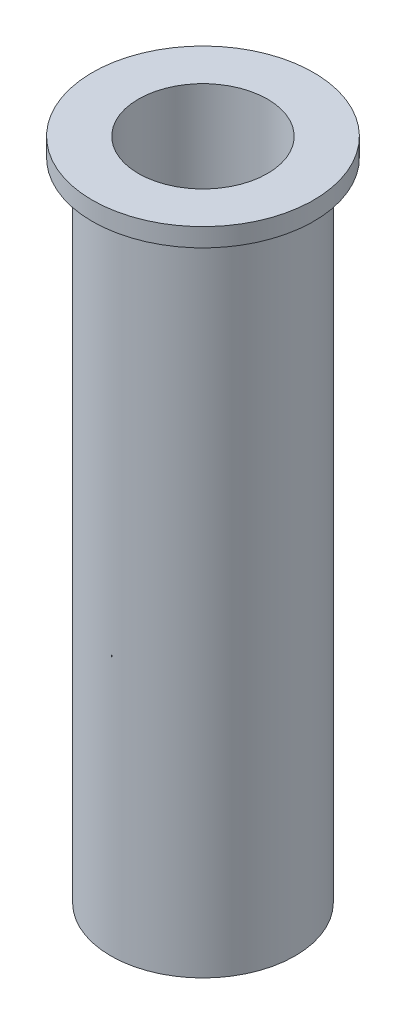
ISO-10303-21;
HEADER;
FILE_DESCRIPTION(('STEP AP214'),'2;1');
FILE_NAME('part.step','',(''),(''),'','','');
FILE_SCHEMA(('AUTOMOTIVE_DESIGN { 1 0 10303 214 1 1 1 1 }'));
ENDSEC;
DATA;
#1=APPLICATION_CONTEXT('core data for automotive mechanical design processes');
#2=APPLICATION_PROTOCOL_DEFINITION('international standard','automotive_design',2000,#1);
#3=PRODUCT_CONTEXT('',#1,'mechanical');
#4=PRODUCT('Part','Part','',(#3));
#5=PRODUCT_RELATED_PRODUCT_CATEGORY('part','',(#4));
#6=PRODUCT_DEFINITION_FORMATION('','',#4);
#7=PRODUCT_DEFINITION_CONTEXT('part definition',#1,'design');
#8=PRODUCT_DEFINITION('design','',#6,#7);
#9=PRODUCT_DEFINITION_SHAPE('','',#8);
#10=(LENGTH_UNIT() NAMED_UNIT(*) SI_UNIT(.MILLI.,.METRE.));
#11=(NAMED_UNIT(*) PLANE_ANGLE_UNIT() SI_UNIT($,.RADIAN.));
#12=(NAMED_UNIT(*) SI_UNIT($,.STERADIAN.) SOLID_ANGLE_UNIT());
#13=UNCERTAINTY_MEASURE_WITH_UNIT(LENGTH_MEASURE(1.E-05),#10,'distance_accuracy_value','');
#14=(GEOMETRIC_REPRESENTATION_CONTEXT(3) GLOBAL_UNCERTAINTY_ASSIGNED_CONTEXT((#13)) GLOBAL_UNIT_ASSIGNED_CONTEXT((#10,
#11,#12)) REPRESENTATION_CONTEXT('',''));
#15=CARTESIAN_POINT('',(0.,0.,0.));
#16=DIRECTION('',(0.,0.,1.));
#17=DIRECTION('',(1.,0.,0.));
#18=AXIS2_PLACEMENT_3D('',#15,#16,#17);
#19=CARTESIAN_POINT('',(0.,70.,0.));
#20=DIRECTION('',(0.,-1.,0.));
#21=DIRECTION('',(0.,0.,-1.));
#22=AXIS2_PLACEMENT_3D('',#19,#20,#21);
#23=CYLINDRICAL_SURFACE('',#22,10.);
#24=CARTESIAN_POINT('',(-9.79795897113271,58.,-2.));
#25=CARTESIAN_POINT('',(-9.79795611157838,58.0556671372987,-2.00000029709047));
#26=CARTESIAN_POINT('',(-9.79843398465431,58.1113070388049,-1.99767440405642));
#27=CARTESIAN_POINT('',(-9.80032138150132,58.2221774356675,-1.98839986829158));
#28=CARTESIAN_POINT('',(-9.80173079002197,58.2774079808152,-1.98145179742019));
#29=CARTESIAN_POINT('',(-9.8073028328515,58.4417098803016,-1.95376239954904));
#30=CARTESIAN_POINT('',(-9.81280956758554,58.5496628575345,-1.92617555297558));
#31=CARTESIAN_POINT('',(-9.8267766040168,58.7592851934839,-1.85359362042639));
#32=CARTESIAN_POINT('',(-9.83523723174864,58.8609538571135,-1.80859661275257));
#33=CARTESIAN_POINT('',(-9.85415440257657,59.0553297677597,-1.7025082088197));
#34=CARTESIAN_POINT('',(-9.86461115250626,59.1480360846177,-1.64141514447462));
#35=CARTESIAN_POINT('',(-9.88650550448304,59.3231196733701,-1.50396101869285));
#36=CARTESIAN_POINT('',(-9.89795377776164,59.4053525644588,-1.42741780364326));
#37=CARTESIAN_POINT('',(-9.92044851228358,59.5559088785751,-1.26162118198369));
#38=CARTESIAN_POINT('',(-9.93149491105252,59.624230146461,-1.17236580968336));
#39=CARTESIAN_POINT('',(-9.95205620855081,59.7455778018475,-0.982720106800591));
#40=CARTESIAN_POINT('',(-9.96155694564014,59.7984659384246,-0.882239649549986));
#41=CARTESIAN_POINT('',(-9.97783510908995,59.8865517690996,-0.673602404217798));
#42=CARTESIAN_POINT('',(-9.9846129382442,59.9217520799118,-0.565446754297828));
#43=CARTESIAN_POINT('',(-9.99460635553984,59.9730140969379,-0.346034817774204));
#44=CARTESIAN_POINT('',(-9.99786765043076,59.9893215789678,-0.234838069151996));
#45=CARTESIAN_POINT('',(-10.0006184349224,60.0031019588768,-0.0112397534982637));
#46=CARTESIAN_POINT('',(-10.000108200481,60.0005762347569,0.101161724783846));
#47=CARTESIAN_POINT('',(-9.99540868887644,59.9769475992568,0.322284405513383));
#48=CARTESIAN_POINT('',(-9.9912719366342,59.9561099001905,0.431035226714458));
#49=CARTESIAN_POINT('',(-9.97984349003516,59.8968696460479,0.643464013108166));
#50=CARTESIAN_POINT('',(-9.97255169250401,59.8584665165555,0.747141812282545));
#51=CARTESIAN_POINT('',(-9.95554578241051,59.7649391930093,0.947240542625917));
#52=CARTESIAN_POINT('',(-9.94581664782192,59.7097108261481,1.04361145363294));
#53=CARTESIAN_POINT('',(-9.92500903258345,59.5841794594466,1.22581287576612));
#54=CARTESIAN_POINT('',(-9.91393044014086,59.5138752103125,1.31164251244036));
#55=CARTESIAN_POINT('',(-9.8914207473701,59.3587432767496,1.47189241307715));
#56=CARTESIAN_POINT('',(-9.8799868648348,59.2736851958569,1.54608938999208));
#57=CARTESIAN_POINT('',(-9.85823412232848,59.0921904830222,1.67922179979889));
#58=CARTESIAN_POINT('',(-9.84791557170815,58.9957507096675,1.73815300484306));
#59=CARTESIAN_POINT('',(-9.82955460084642,58.7938951901082,1.83915990928954));
#60=CARTESIAN_POINT('',(-9.8215183899669,58.6884559532069,1.881189753269));
#61=CARTESIAN_POINT('',(-9.80872322124987,58.4718827374886,1.94681419465982));
#62=CARTESIAN_POINT('',(-9.80395938256574,58.3607575067037,1.97043625496866));
#63=CARTESIAN_POINT('',(-9.80006354383926,58.2072863663071,1.98966587624393));
#64=CARTESIAN_POINT('',(-9.79927519743986,58.1658917204351,1.99354251131102));
#65=CARTESIAN_POINT('',(-9.79822334773544,58.0830042717252,1.9987063293293));
#66=CARTESIAN_POINT('',(-9.79795896609649,58.0415117500884,1.99999784580931));
#67=CARTESIAN_POINT('',(-9.79795897113271,58.,2.));
#68=B_SPLINE_CURVE_WITH_KNOTS('',3,(#24,#25,#26,#27,#28,#29,#30,#31,#32,#33,#34,#35,#36,#37,#38,
#39,#40,#41,#42,#43,#44,#45,#46,#47,#48,#49,#50,#51,#52,#53,#54,#55,#56,#57,#58,#59,#60,#61,#62,
#63,#64,#65,#66,#67),.UNSPECIFIED.,.F.,.F.,(4,2,2,2,2,2,2,2,2,2,2,2,2,2,2,2,2,2,2,2,2,4),(0.,
0.166897020715845,0.33377339664307,0.666722601037227,0.999708566174145,1.33272905329864,
1.66993288931439,2.00718892413592,2.34737937755194,2.68751948879679,3.02318320738907,
3.35882236614863,3.68967912555437,4.0205467052512,4.35350597112352,4.68649283901807,
5.02524540329292,5.3640916848566,5.70385119298727,6.04310283225105,6.16778801087552,
6.29226399953898),.UNSPECIFIED.);
#69=CARTESIAN_POINT('',(-9.79795897113271,58.,-2.));
#70=VERTEX_POINT('',#69);
#71=CARTESIAN_POINT('',(-9.79795897113271,58.,2.));
#72=VERTEX_POINT('',#71);
#73=EDGE_CURVE('E118',#70,#72,#68,.T.);
#74=ORIENTED_EDGE('',*,*,#73,.T.);
#75=DIRECTION('',(0.,-1.,0.));
#76=VECTOR('',#75,1.);
#77=CARTESIAN_POINT('',(-9.79795897113271,70.,2.));
#78=LINE('',#77,#76);
#79=CARTESIAN_POINT('',(-9.79795897113271,48.,2.));
#80=VERTEX_POINT('',#79);
#81=EDGE_CURVE('E126',#72,#80,#78,.T.);
#82=ORIENTED_EDGE('',*,*,#81,.T.);
#83=CARTESIAN_POINT('',(-9.79795897113271,48.,2.));
#84=CARTESIAN_POINT('',(-9.79795611157838,47.9443328627013,2.00000029709046));
#85=CARTESIAN_POINT('',(-9.79843398465431,47.8886929611951,1.99767440405641));
#86=CARTESIAN_POINT('',(-9.80032138150132,47.7778225643325,1.98839986829158));
#87=CARTESIAN_POINT('',(-9.80173079002197,47.7225920191848,1.98145179742018));
#88=CARTESIAN_POINT('',(-9.8073028328515,47.5582901196984,1.95376239954903));
#89=CARTESIAN_POINT('',(-9.81280956758554,47.4503371424655,1.92617555297558));
#90=CARTESIAN_POINT('',(-9.8267766040168,47.2407148065161,1.85359362042638));
#91=CARTESIAN_POINT('',(-9.83523723174864,47.1390461428865,1.80859661275256));
#92=CARTESIAN_POINT('',(-9.85415440257657,46.9446702322403,1.70250820881969));
#93=CARTESIAN_POINT('',(-9.86461115250626,46.8519639153823,1.64141514447461));
#94=CARTESIAN_POINT('',(-9.88650550448304,46.6768803266299,1.50396101869285));
#95=CARTESIAN_POINT('',(-9.89795377776164,46.5946474355412,1.42741780364326));
#96=CARTESIAN_POINT('',(-9.92044851228358,46.4440911214249,1.26162118198369));
#97=CARTESIAN_POINT('',(-9.93149491105252,46.375769853539,1.17236580968335));
#98=CARTESIAN_POINT('',(-9.95205620855081,46.2544221981525,0.982720106800585));
#99=CARTESIAN_POINT('',(-9.96155694564014,46.2015340615754,0.882239649549979));
#100=CARTESIAN_POINT('',(-9.97783510908995,46.1134482309004,0.673602404217791));
#101=CARTESIAN_POINT('',(-9.9846129382442,46.0782479200882,0.565446754297822));
#102=CARTESIAN_POINT('',(-9.99460635553984,46.0269859030621,0.346034817774198));
#103=CARTESIAN_POINT('',(-9.99786765043076,46.0106784210322,0.234838069151989));
#104=CARTESIAN_POINT('',(-10.0006184349224,45.9968980411232,0.0112397534982574));
#105=CARTESIAN_POINT('',(-10.000108200481,45.9994237652431,-0.101161724783852));
#106=CARTESIAN_POINT('',(-9.99540868887644,46.0230524007432,-0.32228440551339));
#107=CARTESIAN_POINT('',(-9.9912719366342,46.0438900998095,-0.431035226714465));
#108=CARTESIAN_POINT('',(-9.97984349003516,46.1031303539521,-0.643464013108173));
#109=CARTESIAN_POINT('',(-9.97255169250401,46.1415334834445,-0.747141812282552));
#110=CARTESIAN_POINT('',(-9.95554578241051,46.2350608069907,-0.947240542625924));
#111=CARTESIAN_POINT('',(-9.94581664782192,46.2902891738519,-1.04361145363295));
#112=CARTESIAN_POINT('',(-9.92500903258345,46.4158205405534,-1.22581287576613));
#113=CARTESIAN_POINT('',(-9.91393044014086,46.4861247896875,-1.31164251244037));
#114=CARTESIAN_POINT('',(-9.8914207473701,46.6412567232505,-1.47189241307716));
#115=CARTESIAN_POINT('',(-9.8799868648348,46.7263148041431,-1.54608938999209));
#116=CARTESIAN_POINT('',(-9.85823412232848,46.9078095169778,-1.6792217997989));
#117=CARTESIAN_POINT('',(-9.84791557170815,47.0042492903325,-1.73815300484307));
#118=CARTESIAN_POINT('',(-9.82955460084642,47.2061048098918,-1.83915990928954));
#119=CARTESIAN_POINT('',(-9.8215183899669,47.3115440467932,-1.88118975326901));
#120=CARTESIAN_POINT('',(-9.80872322124987,47.5281172625114,-1.94681419465983));
#121=CARTESIAN_POINT('',(-9.80395938256574,47.6392424932963,-1.97043625496866));
#122=CARTESIAN_POINT('',(-9.80006354383926,47.7927136336929,-1.98966587624394));
#123=CARTESIAN_POINT('',(-9.79927519743986,47.8341082795649,-1.99354251131103));
#124=CARTESIAN_POINT('',(-9.79822334773544,47.9169957282749,-1.99870632932931));
#125=CARTESIAN_POINT('',(-9.79795896609649,47.9584882499116,-1.99999784580932));
#126=CARTESIAN_POINT('',(-9.79795897113271,48.,-2.00000000000001));
#127=B_SPLINE_CURVE_WITH_KNOTS('',3,(#83,#84,#85,#86,#87,#88,#89,#90,#91,#92,#93,#94,#95,#96,
#97,#98,#99,#100,#101,#102,#103,#104,#105,#106,#107,#108,#109,#110,#111,#112,#113,#114,#115,
#116,#117,#118,#119,#120,#121,#122,#123,#124,#125,#126),.UNSPECIFIED.,.F.,.F.,(4,2,2,2,2,2,2,2,
2,2,2,2,2,2,2,2,2,2,2,2,2,4),(0.,0.166897020715845,0.33377339664307,0.666722601037227,
0.999708566174155,1.33272905329864,1.66993288931439,2.00718892413592,2.34737937755194,
2.68751948879679,3.02318320738907,3.35882236614863,3.68967912555437,4.02054670525121,
4.35350597112352,4.68649283901808,5.02524540329292,5.3640916848566,5.70385119298728,
6.04310283225105,6.16778801087553,6.29226399953898),.UNSPECIFIED.);
#128=CARTESIAN_POINT('',(-9.79795897113271,48.,-2.00000000000001));
#129=VERTEX_POINT('',#128);
#130=EDGE_CURVE('E153',#80,#129,#127,.T.);
#131=ORIENTED_EDGE('',*,*,#130,.T.);
#132=DIRECTION('',(0.,-1.,0.));
#133=VECTOR('',#132,1.);
#134=CARTESIAN_POINT('',(-9.79795897113271,70.,-2.));
#135=LINE('',#134,#133);
#136=EDGE_CURVE('E87',#70,#129,#135,.T.);
#137=ORIENTED_EDGE('',*,*,#136,.F.);
#138=EDGE_LOOP('',(#74,#82,#131,#137));
#139=FACE_BOUND('',#138,.T.);
#140=CARTESIAN_POINT('',(-9.53939201416945,16.,-3.00000000000001));
#141=CARTESIAN_POINT('',(-9.5393937145396,15.8356109041152,-2.99999795267529));
#142=CARTESIAN_POINT('',(-9.54368780418137,15.671201551712,-2.98644216334285));
#143=CARTESIAN_POINT('',(-9.56033156605799,15.3471895008161,-2.93271688893499));
#144=CARTESIAN_POINT('',(-9.57268392986936,15.1875884269971,-2.89253851147157));
#145=CARTESIAN_POINT('',(-9.60392204971265,14.8779305434565,-2.78705506539911));
#146=CARTESIAN_POINT('',(-9.62279693406464,14.7278583407338,-2.72179178788487));
#147=CARTESIAN_POINT('',(-9.66493865095134,14.4407561320094,-2.56812843835859));
#148=CARTESIAN_POINT('',(-9.68820614082039,14.3037280826311,-2.47972490274106));
#149=CARTESIAN_POINT('',(-9.73733724371531,14.0422672188453,-2.27929508283254));
#150=CARTESIAN_POINT('',(-9.76325616623271,13.9183082041074,-2.16666414351614));
#151=CARTESIAN_POINT('',(-9.81429723873514,13.690724097355,-1.9222724751592));
#152=CARTESIAN_POINT('',(-9.8394192859541,13.5871016191002,-1.79050929092223));
#153=CARTESIAN_POINT('',(-9.88666429158777,13.4010746003334,-1.50822287558739));
#154=CARTESIAN_POINT('',(-9.90871448684808,13.3191531511144,-1.35736804267164));
#155=CARTESIAN_POINT('',(-9.94668871841369,13.1820254819145,-1.04324929073871));
#156=CARTESIAN_POINT('',(-9.96261407578992,13.1268135002851,-0.879988056775829));
#157=CARTESIAN_POINT('',(-9.98615292007178,13.046239997819,-0.550647705261665));
#158=CARTESIAN_POINT('',(-9.99399114738673,13.0200697446946,-0.384782797907609));
#159=CARTESIAN_POINT('',(-10.001264030027,12.9957653507071,-0.0508436474986341));
#160=CARTESIAN_POINT('',(-10.0007004504217,12.9976253211961,0.117230124100737));
#161=CARTESIAN_POINT('',(-9.99139207635305,13.028785737086,0.445142313200309));
#162=CARTESIAN_POINT('',(-9.98290840410476,13.0572103876197,0.605072535282655));
#163=CARTESIAN_POINT('',(-9.95903044225231,13.1392626719886,0.91777842688507));
#164=CARTESIAN_POINT('',(-9.94363571501341,13.1928919018855,1.07055364264577));
#165=CARTESIAN_POINT('',(-9.90730441973756,13.324424046837,1.36669465270247));
#166=CARTESIAN_POINT('',(-9.88630539352772,13.402602405614,1.50993012938863));
#167=CARTESIAN_POINT('',(-9.84099281296778,13.5807957048571,1.78152934756662));
#168=CARTESIAN_POINT('',(-9.81667847277943,13.6808158259292,1.90988954974544));
#169=CARTESIAN_POINT('',(-9.76623100973852,13.9043955015009,2.15332096305836));
#170=CARTESIAN_POINT('',(-9.74006390633503,14.0287138380508,2.26768916079755));
#171=CARTESIAN_POINT('',(-9.68967959784414,14.2950200357888,2.47415303080114));
#172=CARTESIAN_POINT('',(-9.66546258669242,14.437009650811,2.56624648967451));
#173=CARTESIAN_POINT('',(-9.62155806359713,14.7364789384722,2.72627990669511));
#174=CARTESIAN_POINT('',(-9.60191621258491,14.8940940916175,2.79397978469377));
#175=CARTESIAN_POINT('',(-9.5699278496379,15.2192144167786,2.90166725750739));
#176=CARTESIAN_POINT('',(-9.5575789579664,15.3867163430351,2.94166389279494));
#177=CARTESIAN_POINT('',(-9.54209699116239,15.7201647215024,2.99149540565762));
#178=CARTESIAN_POINT('',(-9.53863757349918,15.8859364477944,3.00239892760806));
#179=CARTESIAN_POINT('',(-9.54042384874813,16.2169458000134,2.99671894465741));
#180=CARTESIAN_POINT('',(-9.54566832310787,16.38218349746,2.98013928742558));
#181=CARTESIAN_POINT('',(-9.56395117112154,16.7029767559434,2.92091527148478));
#182=CARTESIAN_POINT('',(-9.57678353015602,16.8586723285275,2.87895922862586));
#183=CARTESIAN_POINT('',(-9.6085828246183,17.1608033816294,2.77097155495853));
#184=CARTESIAN_POINT('',(-9.62755070717977,17.307237428281,2.70493620685511));
#185=CARTESIAN_POINT('',(-9.67011670046269,17.5910349281444,2.54863742393007));
#186=CARTESIAN_POINT('',(-9.69382542139644,17.7280494419716,2.45777128345459));
#187=CARTESIAN_POINT('',(-9.74296411293928,17.9852762123616,2.25510603200766));
#188=CARTESIAN_POINT('',(-9.76839449459994,18.1054844352256,2.14330191069792));
#189=CARTESIAN_POINT('',(-9.8192726709633,18.3303608116295,1.89691026498719));
#190=CARTESIAN_POINT('',(-9.84468490126012,18.434271257974,1.76162213171486));
#191=CARTESIAN_POINT('',(-9.89169703497298,18.6179334020555,1.47492356918049));
#192=CARTESIAN_POINT('',(-9.91329712769433,18.6976862995629,1.32351394108788));
#193=CARTESIAN_POINT('',(-9.95011940949915,18.8300000611366,1.00987100941044));
#194=CARTESIAN_POINT('',(-9.96538906849932,18.882764032318,0.84772924407567));
#195=CARTESIAN_POINT('',(-9.98803959193654,18.9601218377808,0.516339933009168));
#196=CARTESIAN_POINT('',(-9.9954227134176,18.9847237318968,0.347094434709517));
#197=CARTESIAN_POINT('',(-10.001330881628,19.004446088109,0.0133043077654778));
#198=CARTESIAN_POINT('',(-10.0001861022264,19.0006653908157,-0.151170358172421));
#199=CARTESIAN_POINT('',(-9.98994528930073,18.9663567350018,-0.477038962328816));
#200=CARTESIAN_POINT('',(-9.98084970660925,18.9358302930391,-0.638433074693065));
#201=CARTESIAN_POINT('',(-9.95582336716653,18.8495766772008,-0.951871626082723));
#202=CARTESIAN_POINT('',(-9.93996705801731,18.794123638702,-1.10399785470279));
#203=CARTESIAN_POINT('',(-9.903058860789,18.6598361709856,-1.39686647550411));
#204=CARTESIAN_POINT('',(-9.88200611899892,18.5809978994276,-1.53760699210117));
#205=CARTESIAN_POINT('',(-9.83607931656456,18.3992530851399,-1.80860378484113));
#206=CARTESIAN_POINT('',(-9.81110453847118,18.2956571399985,-1.93838050015354));
#207=CARTESIAN_POINT('',(-9.76047074424667,18.0685792233344,-2.17907514269189));
#208=CARTESIAN_POINT('',(-9.73481153282158,17.9450915242037,-2.28998761920388));
#209=CARTESIAN_POINT('',(-9.68481361262638,17.677318443379,-2.49312538789098));
#210=CARTESIAN_POINT('',(-9.6605370538697,17.5325228932191,-2.58469519515913));
#211=CARTESIAN_POINT('',(-9.61705095017586,17.228889651678,-2.74208627057552));
#212=CARTESIAN_POINT('',(-9.59783897193911,17.0700587527976,-2.80791991114578));
#213=CARTESIAN_POINT('',(-9.56855633435189,16.7605191367875,-2.906038850659));
#214=CARTESIAN_POINT('',(-9.5577230968104,16.610782706138,-2.94117718022464));
#215=CARTESIAN_POINT('',(-9.54314085194333,16.3073695550085,-2.98815637670289));
#216=CARTESIAN_POINT('',(-9.53939042442861,16.1536936307095,-3.00000191412191));
#217=CARTESIAN_POINT('',(-9.53939201416945,16.,-3.00000000000001));
#218=B_SPLINE_CURVE_WITH_KNOTS('',3,(#140,#141,#142,#143,#144,#145,#146,#147,#148,#149,#150,
#151,#152,#153,#154,#155,#156,#157,#158,#159,#160,#161,#162,#163,#164,#165,#166,#167,#168,#169,
#170,#171,#172,#173,#174,#175,#176,#177,#178,#179,#180,#181,#182,#183,#184,#185,#186,#187,#188,
#189,#190,#191,#192,#193,#194,#195,#196,#197,#198,#199,#200,#201,#202,#203,#204,#205,#206,#207,
#208,#209,#210,#211,#212,#213,#214,#215,#216,#217),.UNSPECIFIED.,.T.,.F.,(4,2,2,2,2,2,2,2,2,2,2,
2,2,2,2,2,2,2,2,2,2,2,2,2,2,2,2,2,2,2,2,2,2,2,2,2,2,2,4),(0.,0.492600331831082,
0.985365283377999,1.47731282893239,1.9693340507402,2.47546300015968,2.98165695742545,
3.49831878547289,4.01486911175754,4.51664280299115,5.01831108202881,5.5040025198176,
5.98972471780752,6.48110418671352,6.97260033181661,7.48304294046556,7.99353624983726,
8.50892476494934,9.02414501262032,9.52016161585828,10.0161087821998,10.4991718988284,
10.9823096209678,11.4784146362399,11.9746385186306,12.4895901220641,13.0045161465361,
13.5155078363386,14.0263532464857,14.5175260782765,15.0086710610072,15.4945419374965,
15.9804926898797,16.4819925411419,16.9836370526499,17.500232793435,18.016579879331,
18.477223077201,18.9377739007233),.UNSPECIFIED.);
#219=CARTESIAN_POINT('',(-9.53939201416945,16.,-3.00000000000001));
#220=VERTEX_POINT('',#219);
#221=EDGE_CURVE('E137',#220,#220,#218,.T.);
#222=ORIENTED_EDGE('',*,*,#221,.F.);
#223=EDGE_LOOP('',(#222));
#224=FACE_BOUND('',#223,.T.);
#225=CARTESIAN_POINT('',(0.,70.,0.));
#226=DIRECTION('',(0.,1.,0.));
#227=DIRECTION('',(0.,0.,1.));
#228=AXIS2_PLACEMENT_3D('',#225,#226,#227);
#229=CIRCLE('',#228,10.);
#230=CARTESIAN_POINT('',(0.,70.,10.));
#231=VERTEX_POINT('',#230);
#232=EDGE_CURVE('E80',#231,#231,#229,.T.);
#233=ORIENTED_EDGE('',*,*,#232,.F.);
#234=EDGE_LOOP('',(#233));
#235=FACE_BOUND('',#234,.T.);
#236=CARTESIAN_POINT('',(0.,0.,0.));
#237=DIRECTION('',(0.,1.,0.));
#238=DIRECTION('',(0.,0.,1.));
#239=AXIS2_PLACEMENT_3D('',#236,#237,#238);
#240=CIRCLE('',#239,10.);
#241=CARTESIAN_POINT('',(0.,0.,10.));
#242=VERTEX_POINT('',#241);
#243=EDGE_CURVE('E176',#242,#242,#240,.T.);
#244=ORIENTED_EDGE('',*,*,#243,.T.);
#245=EDGE_LOOP('',(#244));
#246=FACE_BOUND('',#245,.T.);
#247=ADVANCED_FACE('F37',(#139,#224,#235,#246),#23,.T.);
#248=CARTESIAN_POINT('',(0.,0.,0.));
#249=DIRECTION('',(0.,1.,0.));
#250=DIRECTION('',(0.,0.,1.));
#251=AXIS2_PLACEMENT_3D('',#248,#249,#250);
#252=PLANE('',#251);
#253=CARTESIAN_POINT('',(0.,0.,0.));
#254=DIRECTION('',(0.,-1.,0.));
#255=DIRECTION('',(0.,0.,-1.));
#256=AXIS2_PLACEMENT_3D('',#253,#254,#255);
#257=CIRCLE('',#256,7.);
#258=CARTESIAN_POINT('',(0.,0.,-7.));
#259=VERTEX_POINT('',#258);
#260=EDGE_CURVE('E185',#259,#259,#257,.T.);
#261=ORIENTED_EDGE('',*,*,#260,.F.);
#262=EDGE_LOOP('',(#261));
#263=FACE_BOUND('',#262,.T.);
#264=ORIENTED_EDGE('',*,*,#243,.F.);
#265=EDGE_LOOP('',(#264));
#266=FACE_BOUND('',#265,.T.);
#267=ADVANCED_FACE('F167',(#263,#266),#252,.F.);
#268=CARTESIAN_POINT('',(0.,72.,0.));
#269=DIRECTION('',(0.,-1.,0.));
#270=DIRECTION('',(0.,0.,-1.));
#271=AXIS2_PLACEMENT_3D('',#268,#269,#270);
#272=CYLINDRICAL_SURFACE('',#271,12.);
#273=CARTESIAN_POINT('',(0.,72.,0.));
#274=DIRECTION('',(0.,1.,0.));
#275=DIRECTION('',(0.,0.,1.));
#276=AXIS2_PLACEMENT_3D('',#273,#274,#275);
#277=CIRCLE('',#276,12.);
#278=CARTESIAN_POINT('',(0.,72.,12.));
#279=VERTEX_POINT('',#278);
#280=EDGE_CURVE('E178',#279,#279,#277,.T.);
#281=ORIENTED_EDGE('',*,*,#280,.F.);
#282=EDGE_LOOP('',(#281));
#283=FACE_BOUND('',#282,.T.);
#284=CARTESIAN_POINT('',(0.,70.,0.));
#285=DIRECTION('',(0.,1.,0.));
#286=DIRECTION('',(0.,0.,1.));
#287=AXIS2_PLACEMENT_3D('',#284,#285,#286);
#288=CIRCLE('',#287,12.);
#289=CARTESIAN_POINT('',(0.,70.,12.));
#290=VERTEX_POINT('',#289);
#291=EDGE_CURVE('E181',#290,#290,#288,.T.);
#292=ORIENTED_EDGE('',*,*,#291,.T.);
#293=EDGE_LOOP('',(#292));
#294=FACE_BOUND('',#293,.T.);
#295=ADVANCED_FACE('F194',(#283,#294),#272,.T.);
#296=CARTESIAN_POINT('',(0.,72.,0.));
#297=DIRECTION('',(0.,1.,0.));
#298=DIRECTION('',(0.,0.,1.));
#299=AXIS2_PLACEMENT_3D('',#296,#297,#298);
#300=PLANE('',#299);
#301=CARTESIAN_POINT('',(0.,72.,0.));
#302=DIRECTION('',(0.,1.,0.));
#303=DIRECTION('',(0.,0.,1.));
#304=AXIS2_PLACEMENT_3D('',#301,#302,#303);
#305=CIRCLE('',#304,7.);
#306=CARTESIAN_POINT('',(0.,72.,7.));
#307=VERTEX_POINT('',#306);
#308=EDGE_CURVE('E187',#307,#307,#305,.F.);
#309=ORIENTED_EDGE('',*,*,#308,.T.);
#310=EDGE_LOOP('',(#309));
#311=FACE_BOUND('',#310,.T.);
#312=ORIENTED_EDGE('',*,*,#280,.T.);
#313=EDGE_LOOP('',(#312));
#314=FACE_BOUND('',#313,.T.);
#315=ADVANCED_FACE('F198',(#311,#314),#300,.T.);
#316=CARTESIAN_POINT('',(0.,70.,0.));
#317=DIRECTION('',(0.,1.,0.));
#318=DIRECTION('',(0.,0.,1.));
#319=AXIS2_PLACEMENT_3D('',#316,#317,#318);
#320=PLANE('',#319);
#321=ORIENTED_EDGE('',*,*,#232,.T.);
#322=EDGE_LOOP('',(#321));
#323=FACE_BOUND('',#322,.T.);
#324=ORIENTED_EDGE('',*,*,#291,.F.);
#325=EDGE_LOOP('',(#324));
#326=FACE_BOUND('',#325,.T.);
#327=ADVANCED_FACE('F202',(#323,#326),#320,.F.);
#328=CARTESIAN_POINT('',(0.,72.001,0.));
#329=DIRECTION('',(0.,-1.,0.));
#330=DIRECTION('',(0.,0.,-1.));
#331=AXIS2_PLACEMENT_3D('',#328,#329,#330);
#332=CYLINDRICAL_SURFACE('',#331,7.);
#333=CARTESIAN_POINT('',(-6.70820393249937,48.,-2.00000000000001));
#334=CARTESIAN_POINT('',(-6.70819953316985,47.9449659501851,-2.00000099701007));
#335=CARTESIAN_POINT('',(-6.70888204069576,47.8899594805304,-1.99772698657417));
#336=CARTESIAN_POINT('',(-6.71157572918718,47.7803637932319,-1.98866401977601));
#337=CARTESIAN_POINT('',(-6.71358663463581,47.7257744914397,-1.98187599964173));
#338=CARTESIAN_POINT('',(-6.72152750079886,47.563492500609,-1.95485062941111));
#339=CARTESIAN_POINT('',(-6.72936619314296,47.4569243659256,-1.92795143323662));
#340=CARTESIAN_POINT('',(-6.74920530112651,47.2500599710911,-1.85729763181245));
#341=CARTESIAN_POINT('',(-6.76120458746017,47.1497620177413,-1.81354760001119));
#342=CARTESIAN_POINT('',(-6.78800504649993,46.9578633599201,-1.71050096490832));
#343=CARTESIAN_POINT('',(-6.80280735546319,46.8662662051685,-1.65119805319265));
#344=CARTESIAN_POINT('',(-6.83401742233605,46.6918092369882,-1.51692637942785));
#345=CARTESIAN_POINT('',(-6.85045675077389,46.6092358649604,-1.44159286857929));
#346=CARTESIAN_POINT('',(-6.88281888407086,46.4577009472888,-1.27817556590853));
#347=CARTESIAN_POINT('',(-6.89874160290615,46.3887416589872,-1.1900896638107));
#348=CARTESIAN_POINT('',(-6.92863365500318,46.2651698586037,-1.00164390124782));
#349=CARTESIAN_POINT('',(-6.94256116560893,46.210847927891,-0.901086286300637));
#350=CARTESIAN_POINT('',(-6.96652585547357,46.119996617504,-0.691803619902937));
#351=CARTESIAN_POINT('',(-6.9765639649799,46.0834629827771,-0.583080528865992));
#352=CARTESIAN_POINT('',(-6.99139511470933,46.0301658123249,-0.363559728440922));
#353=CARTESIAN_POINT('',(-6.9963181662203,46.0129113417737,-0.25289015277331));
#354=CARTESIAN_POINT('',(-7.0008209646746,45.9971132387428,-0.0301224858411321));
#355=CARTESIAN_POINT('',(-7.00040161984796,45.9985664258825,0.0819753593745424));
#356=CARTESIAN_POINT('',(-6.99436005222991,46.0198064268063,0.300980757605923));
#357=CARTESIAN_POINT('',(-6.98888865037348,46.0390618062169,0.40794465826378));
#358=CARTESIAN_POINT('',(-6.97353876106817,46.0944954852694,0.617053284204988));
#359=CARTESIAN_POINT('',(-6.96366005112714,46.130674639271,0.719197765903903));
#360=CARTESIAN_POINT('',(-6.94039022250968,46.2193097345408,0.917074637107108));
#361=CARTESIAN_POINT('',(-6.92696183576596,46.2719395295427,1.01272458867114));
#362=CARTESIAN_POINT('',(-6.89802743916845,46.3918457822936,1.19400864318192));
#363=CARTESIAN_POINT('',(-6.88252100787083,46.4591252128381,1.27964070780667));
#364=CARTESIAN_POINT('',(-6.85045847438688,46.6091975960498,1.4416242915176));
#365=CARTESIAN_POINT('',(-6.83388462903894,46.6924510869075,1.51754611736985));
#366=CARTESIAN_POINT('',(-6.8020328618046,46.8706972962739,1.65448071052153));
#367=CARTESIAN_POINT('',(-6.78675530825694,46.9656933326901,1.71548924944114));
#368=CARTESIAN_POINT('',(-6.75914312316269,47.165787226184,1.82126577406777));
#369=CARTESIAN_POINT('',(-6.74683461720559,47.2709641036882,1.86589126971572));
#370=CARTESIAN_POINT('',(-6.72687625502192,47.4877120641217,1.93662306415342));
#371=CARTESIAN_POINT('',(-6.71921934043249,47.5992731766452,1.96275743150702));
#372=CARTESIAN_POINT('',(-6.71232934900283,47.7598794618068,1.98612021663037));
#373=CARTESIAN_POINT('',(-6.71078540276084,47.807779354821,1.99132502775505));
#374=CARTESIAN_POINT('',(-6.7087227484044,47.9037782252433,1.99826154104353));
#375=CARTESIAN_POINT('',(-6.70820247662624,47.9518767863759,1.99999854035278));
#376=CARTESIAN_POINT('',(-6.70820393249937,48.,2.));
#377=B_SPLINE_CURVE_WITH_KNOTS('',3,(#333,#334,#335,#336,#337,#338,#339,#340,#341,#342,#343,
#344,#345,#346,#347,#348,#349,#350,#351,#352,#353,#354,#355,#356,#357,#358,#359,#360,#361,#362,
#363,#364,#365,#366,#367,#368,#369,#370,#371,#372,#373,#374,#375,#376),.UNSPECIFIED.,.F.,.F.,(4,
2,2,2,2,2,2,2,2,2,2,2,2,2,2,2,2,2,2,2,2,4),(0.,0.164996871521819,0.32995953254319,
0.658815047363249,0.987581371049872,1.31648125266079,1.65386790579359,1.99131045388568,
2.33502692276063,2.67866113243414,3.01332990723896,3.34794178769256,3.67287650190719,
3.99782762150998,4.32633613500355,4.65491137372593,4.99498620503308,5.33515734656363,
5.6782206809082,6.02076213933639,6.16526974400138,6.30955644126888),.UNSPECIFIED.);
#378=CARTESIAN_POINT('',(-6.70820393249937,48.,-2.00000000000001));
#379=VERTEX_POINT('',#378);
#380=CARTESIAN_POINT('',(-6.70820393249937,48.,2.));
#381=VERTEX_POINT('',#380);
#382=EDGE_CURVE('E75',#379,#381,#377,.T.);
#383=ORIENTED_EDGE('',*,*,#382,.T.);
#384=DIRECTION('',(0.,-1.,0.));
#385=VECTOR('',#384,1.);
#386=CARTESIAN_POINT('',(-6.70820393249937,72.001,2.00000000000001));
#387=LINE('',#386,#385);
#388=CARTESIAN_POINT('',(-6.70820393249937,58.,2.));
#389=VERTEX_POINT('',#388);
#390=EDGE_CURVE('E11',#381,#389,#387,.F.);
#391=ORIENTED_EDGE('',*,*,#390,.T.);
#392=CARTESIAN_POINT('',(-6.70820393249937,58.,2.));
#393=CARTESIAN_POINT('',(-6.70819953316985,58.0550340498149,2.00000099701006));
#394=CARTESIAN_POINT('',(-6.70888204069576,58.1100405194696,1.99772698657416));
#395=CARTESIAN_POINT('',(-6.71157572918718,58.2196362067681,1.988664019776));
#396=CARTESIAN_POINT('',(-6.71358663463581,58.2742255085603,1.98187599964173));
#397=CARTESIAN_POINT('',(-6.72152750079886,58.436507499391,1.95485062941111));
#398=CARTESIAN_POINT('',(-6.72936619314296,58.5430756340744,1.92795143323662));
#399=CARTESIAN_POINT('',(-6.74920530112651,58.7499400289089,1.85729763181245));
#400=CARTESIAN_POINT('',(-6.76120458746017,58.8502379822587,1.81354760001118));
#401=CARTESIAN_POINT('',(-6.78800504649993,59.0421366400799,1.71050096490831));
#402=CARTESIAN_POINT('',(-6.80280735546319,59.1337337948315,1.65119805319265));
#403=CARTESIAN_POINT('',(-6.83401742233605,59.3081907630118,1.51692637942784));
#404=CARTESIAN_POINT('',(-6.85045675077389,59.3907641350396,1.44159286857928));
#405=CARTESIAN_POINT('',(-6.88281888407086,59.5422990527112,1.27817556590852));
#406=CARTESIAN_POINT('',(-6.89874160290615,59.6112583410128,1.19008966381069));
#407=CARTESIAN_POINT('',(-6.92863365500318,59.7348301413963,1.00164390124781));
#408=CARTESIAN_POINT('',(-6.94256116560893,59.789152072109,0.901086286300631));
#409=CARTESIAN_POINT('',(-6.96652585547357,59.8800033824961,0.69180361990293));
#410=CARTESIAN_POINT('',(-6.9765639649799,59.9165370172229,0.583080528865985));
#411=CARTESIAN_POINT('',(-6.99139511470933,59.9698341876751,0.363559728440915));
#412=CARTESIAN_POINT('',(-6.9963181662203,59.9870886582263,0.252890152773303));
#413=CARTESIAN_POINT('',(-7.0008209646746,60.0028867612572,0.0301224858411254));
#414=CARTESIAN_POINT('',(-7.00040161984796,60.0014335741175,-0.0819753593745491));
#415=CARTESIAN_POINT('',(-6.99436005222991,59.9801935731937,-0.30098075760593));
#416=CARTESIAN_POINT('',(-6.98888865037348,59.9609381937831,-0.407944658263787));
#417=CARTESIAN_POINT('',(-6.97353876106817,59.9055045147306,-0.617053284204994));
#418=CARTESIAN_POINT('',(-6.96366005112714,59.8693253607291,-0.71919776590391));
#419=CARTESIAN_POINT('',(-6.94039022250968,59.7806902654592,-0.917074637107112));
#420=CARTESIAN_POINT('',(-6.92696183576596,59.7280604704573,-1.01272458867114));
#421=CARTESIAN_POINT('',(-6.89802743916845,59.6081542177064,-1.19400864318192));
#422=CARTESIAN_POINT('',(-6.88252100787082,59.5408747871619,-1.27964070780667));
#423=CARTESIAN_POINT('',(-6.85045847438688,59.3908024039502,-1.44162429151761));
#424=CARTESIAN_POINT('',(-6.83388462903894,59.3075489130925,-1.51754611736986));
#425=CARTESIAN_POINT('',(-6.8020328618046,59.1293027037261,-1.65448071052154));
#426=CARTESIAN_POINT('',(-6.78675530825694,59.0343066673099,-1.71548924944115));
#427=CARTESIAN_POINT('',(-6.75914312316269,58.834212773816,-1.82126577406778));
#428=CARTESIAN_POINT('',(-6.74683461720559,58.7290358963118,-1.86589126971572));
#429=CARTESIAN_POINT('',(-6.72687625502192,58.5122879358783,-1.93662306415342));
#430=CARTESIAN_POINT('',(-6.71921934043248,58.4007268233548,-1.96275743150703));
#431=CARTESIAN_POINT('',(-6.71232934900283,58.2401205381933,-1.98612021663038));
#432=CARTESIAN_POINT('',(-6.71078540276084,58.192220645179,-1.99132502775506));
#433=CARTESIAN_POINT('',(-6.7087227484044,58.0962217747567,-1.99826154104353));
#434=CARTESIAN_POINT('',(-6.70820247662624,58.0481232136241,-1.99999854035279));
#435=CARTESIAN_POINT('',(-6.70820393249937,58.,-2.));
#436=B_SPLINE_CURVE_WITH_KNOTS('',3,(#392,#393,#394,#395,#396,#397,#398,#399,#400,#401,#402,
#403,#404,#405,#406,#407,#408,#409,#410,#411,#412,#413,#414,#415,#416,#417,#418,#419,#420,#421,
#422,#423,#424,#425,#426,#427,#428,#429,#430,#431,#432,#433,#434,#435),.UNSPECIFIED.,.F.,.F.,(4,
2,2,2,2,2,2,2,2,2,2,2,2,2,2,2,2,2,2,2,2,4),(0.,0.164996871521819,0.32995953254319,
0.658815047363249,0.987581371049872,1.31648125266079,1.65386790579359,1.99131045388568,
2.33502692276063,2.67866113243414,3.01332990723896,3.34794178769256,3.67287650190719,
3.99782762150998,4.32633613500354,4.65491137372592,4.99498620503308,5.33515734656363,
5.6782206809082,6.02076213933639,6.16526974400137,6.30955644126888),.UNSPECIFIED.);
#437=CARTESIAN_POINT('',(-6.70820393249937,58.,-2.));
#438=VERTEX_POINT('',#437);
#439=EDGE_CURVE('E45',#389,#438,#436,.T.);
#440=ORIENTED_EDGE('',*,*,#439,.T.);
#441=DIRECTION('',(0.,-1.,0.));
#442=VECTOR('',#441,1.);
#443=CARTESIAN_POINT('',(-6.70820393249937,72.001,-2.));
#444=LINE('',#443,#442);
#445=EDGE_CURVE('E79',#379,#438,#444,.F.);
#446=ORIENTED_EDGE('',*,*,#445,.F.);
#447=EDGE_LOOP('',(#383,#391,#440,#446));
#448=FACE_BOUND('',#447,.T.);
#449=CARTESIAN_POINT('',(-6.32455532033676,16.,-3.00000000000001));
#450=CARTESIAN_POINT('',(-6.32455623917925,16.0798007630309,-2.99999904512122));
#451=CARTESIAN_POINT('',(-6.32607259589376,16.1596308199706,-2.99680914186365));
#452=CARTESIAN_POINT('',(-6.33207844610818,16.3186868909549,-2.98409481890063));
#453=CARTESIAN_POINT('',(-6.33656983318198,16.3979124877601,-2.97456636476116));
#454=CARTESIAN_POINT('',(-6.35433138320312,16.6340890265433,-2.93654933365817));
#455=CARTESIAN_POINT('',(-6.37188834799809,16.7893199658573,-2.89862942101231));
#456=CARTESIAN_POINT('',(-6.41604959211165,17.0898703155987,-2.79949691759117));
#457=CARTESIAN_POINT('',(-6.44261548670749,17.2352286875862,-2.73838302089272));
#458=CARTESIAN_POINT('',(-6.50173461776113,17.5136255439978,-2.59488993442856));
#459=CARTESIAN_POINT('',(-6.53428667863442,17.6466664396721,-2.51251491871713));
#460=CARTESIAN_POINT('',(-6.60411108322099,17.9054528395043,-2.32303426891366));
#461=CARTESIAN_POINT('',(-6.64154929418065,18.0302862690513,-2.21474428773222));
#462=CARTESIAN_POINT('',(-6.71556787556131,18.2607018570591,-1.97899162523151));
#463=CARTESIAN_POINT('',(-6.75214789882674,18.3662763379976,-1.85152133453085));
#464=CARTESIAN_POINT('',(-6.82236442416004,18.5599192404586,-1.57377489066951));
#465=CARTESIAN_POINT('',(-6.85578586283844,18.6469492520773,-1.42271545416053));
#466=CARTESIAN_POINT('',(-6.91387422205065,18.7939641666446,-1.10640716164426));
#467=CARTESIAN_POINT('',(-6.93854524147057,18.8539617357451,-0.941164994307314));
#468=CARTESIAN_POINT('',(-6.97517471062289,18.941865036361,-0.610764262051997));
#469=CARTESIAN_POINT('',(-6.98775448299434,18.9713460690391,-0.446095117735245));
#470=CARTESIAN_POINT('',(-7.00104925914407,19.0024826967172,-0.113699399968678));
#471=CARTESIAN_POINT('',(-7.00176937203861,19.004150273699,0.0540258257506277));
#472=CARTESIAN_POINT('',(-6.99162033228837,18.9804097522089,0.376268415183317));
#473=CARTESIAN_POINT('',(-6.98149359551673,18.9567362003163,0.530941438169337));
#474=CARTESIAN_POINT('',(-6.95182205628876,18.8859759310798,0.833871717827564));
#475=CARTESIAN_POINT('',(-6.93227655784003,18.8388874835014,0.982128499493926));
#476=CARTESIAN_POINT('',(-6.88526693329209,18.7220934103473,1.27075797068382));
#477=CARTESIAN_POINT('',(-6.85768620781763,18.6520527076709,1.41097529460903));
#478=CARTESIAN_POINT('',(-6.79727675004242,18.4916826446237,1.67803533028445));
#479=CARTESIAN_POINT('',(-6.76444613359548,18.4013459954593,1.80487321302769));
#480=CARTESIAN_POINT('',(-6.69393790301249,18.195190493324,2.05154784007322));
#481=CARTESIAN_POINT('',(-6.6560813910746,18.077981130226,2.17017297686239));
#482=CARTESIAN_POINT('',(-6.5815763134261,17.8252971683505,2.38662617777591));
#483=CARTESIAN_POINT('',(-6.5449282748833,17.6898147261933,2.48444526456873));
#484=CARTESIAN_POINT('',(-6.47566835431169,17.3982201255285,2.659879427577));
#485=CARTESIAN_POINT('',(-6.44325238173047,17.2415358545188,2.73662769389095));
#486=CARTESIAN_POINT('',(-6.3884939447888,16.9157109916567,2.86214771894641));
#487=CARTESIAN_POINT('',(-6.36614379619967,16.746580016742,2.91094082636759));
#488=CARTESIAN_POINT('',(-6.33598550498636,16.412827204388,2.97598670119679));
#489=CARTESIAN_POINT('',(-6.32729797712828,16.2486710193927,2.99421280080631));
#490=CARTESIAN_POINT('',(-6.32292988606606,15.9194510248917,3.00343131976711));
#491=CARTESIAN_POINT('',(-6.32724437007431,15.7543875848925,2.99443410914467));
#492=CARTESIAN_POINT('',(-6.34748143158175,15.4401374262566,2.95126478417859));
#493=CARTESIAN_POINT('',(-6.36257694871081,15.2906442596282,2.91888461082949));
#494=CARTESIAN_POINT('',(-6.40159573000742,14.9993545236303,2.83228012727602));
#495=CARTESIAN_POINT('',(-6.42552113853308,14.8575598334555,2.77805051059371));
#496=CARTESIAN_POINT('',(-6.4807666724858,14.5787901097089,2.64668378105435));
#497=CARTESIAN_POINT('',(-6.51236308247384,14.442292678178,2.56865319415609));
#498=CARTESIAN_POINT('',(-6.57901833984006,14.1836492944887,2.39277124314047));
#499=CARTESIAN_POINT('',(-6.61407874120977,14.0615098378019,2.29491096228641));
#500=CARTESIAN_POINT('',(-6.68739396565838,13.8239710744273,2.07211495440808));
#501=CARTESIAN_POINT('',(-6.72566111015056,13.7100847627763,1.94556360485738));
#502=CARTESIAN_POINT('',(-6.79826947497518,13.5048657627252,1.67428466903031));
#503=CARTESIAN_POINT('',(-6.83261030191759,13.4135353332079,1.52955526448109));
#504=CARTESIAN_POINT('',(-6.89381439172467,13.2559173101929,1.22458078741679));
#505=CARTESIAN_POINT('',(-6.92064008929576,13.1897549537128,1.06426298143305));
#506=CARTESIAN_POINT('',(-6.96347660484597,13.0858502018438,0.733319762769433));
#507=CARTESIAN_POINT('',(-6.9794942735468,13.0480898019916,0.562700954301769));
#508=CARTESIAN_POINT('',(-6.99808081286415,13.0044225398434,0.229480384595666));
#509=CARTESIAN_POINT('',(-7.00154837158207,12.9963861794806,0.0672060876467106));
#510=CARTESIAN_POINT('',(-6.99717401704727,13.0065955187403,-0.256339620951767));
#511=CARTESIAN_POINT('',(-6.98933429595527,13.024836124004,-0.417611220908524));
#512=CARTESIAN_POINT('',(-6.96371224258031,13.0855535041726,-0.728044798339697));
#513=CARTESIAN_POINT('',(-6.9463310265813,13.1270538473655,-0.877433690400422));
#514=CARTESIAN_POINT('',(-6.90358200259661,13.2320161839198,-1.16704890744754));
#515=CARTESIAN_POINT('',(-6.87821272472253,13.2954822194157,-1.30727354037359));
#516=CARTESIAN_POINT('',(-6.82048100144583,13.445789887836,-1.58164154030708));
#517=CARTESIAN_POINT('',(-6.78785230171247,13.5335659218535,-1.71521554911027));
#518=CARTESIAN_POINT('',(-6.71941601876114,13.7286817135381,-1.96631980223032));
#519=CARTESIAN_POINT('',(-6.68360718068101,13.8360292117295,-2.08384366642576));
#520=CARTESIAN_POINT('',(-6.60956029826528,14.0763838634431,-2.30839582375668));
#521=CARTESIAN_POINT('',(-6.57133471854878,14.210688414619,-2.41404185093548));
#522=CARTESIAN_POINT('',(-6.49938146624855,14.4963461327278,-2.60157161791914));
#523=CARTESIAN_POINT('',(-6.46565641748318,14.6477091507598,-2.6834415286309));
#524=CARTESIAN_POINT('',(-6.42172587804179,14.8843824410763,-2.78618250414779));
#525=CARTESIAN_POINT('',(-6.40819457191417,14.964855759159,-2.81707998873812));
#526=CARTESIAN_POINT('',(-6.38380411418013,15.1285162228321,-2.87192428390113));
#527=CARTESIAN_POINT('',(-6.37294364206054,15.2117020041912,-2.89587453038154));
#528=CARTESIAN_POINT('',(-6.35433014729515,15.3799308076813,-2.93649221837599));
#529=CARTESIAN_POINT('',(-6.3465689441917,15.464968307382,-2.9531788427136));
#530=CARTESIAN_POINT('',(-6.33442493706763,15.6363627717129,-2.97913893233313));
#531=CARTESIAN_POINT('',(-6.33003954418514,15.7227186733412,-2.9884180785096));
#532=CARTESIAN_POINT('',(-6.32647229512562,15.8410614001764,-2.99595579124566));
#533=CARTESIAN_POINT('',(-6.32575401974704,15.8728242807599,-2.99747183035652));
#534=CARTESIAN_POINT('',(-6.32479534540929,15.9363898891686,-2.99949413311609));
#535=CARTESIAN_POINT('',(-6.32455495409998,15.9681926176233,-3.00000038060031));
#536=CARTESIAN_POINT('',(-6.32455532033676,16.,-3.00000000000001));
#537=B_SPLINE_CURVE_WITH_KNOTS('',3,(#449,#450,#451,#452,#453,#454,#455,#456,#457,#458,#459,
#460,#461,#462,#463,#464,#465,#466,#467,#468,#469,#470,#471,#472,#473,#474,#475,#476,#477,#478,
#479,#480,#481,#482,#483,#484,#485,#486,#487,#488,#489,#490,#491,#492,#493,#494,#495,#496,#497,
#498,#499,#500,#501,#502,#503,#504,#505,#506,#507,#508,#509,#510,#511,#512,#513,#514,#515,#516,
#517,#518,#519,#520,#521,#522,#523,#524,#525,#526,#527,#528,#529,#530,#531,#532,#533,#534,#535,
#536),.UNSPECIFIED.,.T.,.F.,(4,2,2,2,2,2,2,2,2,2,2,2,2,2,2,2,2,2,2,2,2,2,2,2,2,2,2,2,2,2,2,2,2,
2,2,2,2,2,2,2,2,2,2,4),(0.,0.239366653231037,0.478885807272612,0.958574399125931,
1.43624431857918,1.91382053150697,2.41995684393642,2.92629448725105,3.45610451675015,
3.98566604296333,4.48627308722846,4.98666446539179,5.45487182502104,5.92311378779297,
6.39852111765621,6.87409945213909,7.38485137094337,7.89582322238326,8.42542768080315,
8.95462715213609,9.44812252419892,9.94142993544505,10.4004743903489,10.8596303986217,
11.3387499488479,11.8180854227975,12.3391595177845,12.8602857751477,13.3839722669446,
13.9073265049035,14.3923682623503,14.8773159966024,15.3432850585276,15.8093399138768,
16.2966585998759,16.784170440423,17.3070906286304,17.8303143607246,18.0917878499581,
18.3531318004373,18.6137813055803,18.8742307225593,18.9696371385413,19.0650450817536),.UNSPECIFIED.);
#538=CARTESIAN_POINT('',(-6.32455532033676,16.,-3.00000000000001));
#539=VERTEX_POINT('',#538);
#540=EDGE_CURVE('E130',#539,#539,#537,.T.);
#541=ORIENTED_EDGE('',*,*,#540,.F.);
#542=EDGE_LOOP('',(#541));
#543=FACE_BOUND('',#542,.T.);
#544=ORIENTED_EDGE('',*,*,#308,.F.);
#545=EDGE_LOOP('',(#544));
#546=FACE_BOUND('',#545,.T.);
#547=ORIENTED_EDGE('',*,*,#260,.T.);
#548=EDGE_LOOP('',(#547));
#549=FACE_BOUND('',#548,.T.);
#550=ADVANCED_FACE('F92',(#448,#543,#546,#549),#332,.F.);
#551=CARTESIAN_POINT('',(-12.001,16.,0.));
#552=DIRECTION('',(1.,0.,0.));
#553=DIRECTION('',(0.,0.,-1.));
#554=AXIS2_PLACEMENT_3D('',#551,#552,#553);
#555=CYLINDRICAL_SURFACE('',#554,3.);
#556=ORIENTED_EDGE('',*,*,#540,.T.);
#557=EDGE_LOOP('',(#556));
#558=FACE_BOUND('',#557,.T.);
#559=ORIENTED_EDGE('',*,*,#221,.T.);
#560=EDGE_LOOP('',(#559));
#561=FACE_BOUND('',#560,.T.);
#562=ADVANCED_FACE('F143',(#558,#561),#555,.F.);
#563=CARTESIAN_POINT('',(-12.,0.,1.99999999999998));
#564=DIRECTION('',(0.,0.,1.));
#565=DIRECTION('',(0.,-1.,0.));
#566=AXIS2_PLACEMENT_3D('',#563,#564,#565);
#567=PLANE('',#566);
#568=DIRECTION('',(1.,0.,0.));
#569=VECTOR('',#568,1.);
#570=CARTESIAN_POINT('',(-12.,58.,2.));
#571=LINE('',#570,#569);
#572=EDGE_CURVE('E159',#72,#389,#571,.T.);
#573=ORIENTED_EDGE('',*,*,#572,.T.);
#574=ORIENTED_EDGE('',*,*,#390,.F.);
#575=DIRECTION('',(1.,0.,0.));
#576=VECTOR('',#575,1.);
#577=CARTESIAN_POINT('',(-12.,48.,2.));
#578=LINE('',#577,#576);
#579=EDGE_CURVE('E57',#80,#381,#578,.T.);
#580=ORIENTED_EDGE('',*,*,#579,.F.);
#581=ORIENTED_EDGE('',*,*,#81,.F.);
#582=EDGE_LOOP('',(#573,#574,#580,#581));
#583=FACE_BOUND('',#582,.T.);
#584=ADVANCED_FACE('F114',(#583),#567,.F.);
#585=CARTESIAN_POINT('',(-12.,58.,0.));
#586=DIRECTION('',(1.,0.,0.));
#587=DIRECTION('',(0.,0.,-1.));
#588=AXIS2_PLACEMENT_3D('',#585,#586,#587);
#589=CYLINDRICAL_SURFACE('',#588,2.);
#590=DIRECTION('',(1.,0.,0.));
#591=VECTOR('',#590,1.);
#592=CARTESIAN_POINT('',(-12.,58.,-2.));
#593=LINE('',#592,#591);
#594=EDGE_CURVE('E89',#70,#438,#593,.T.);
#595=ORIENTED_EDGE('',*,*,#594,.T.);
#596=ORIENTED_EDGE('',*,*,#439,.F.);
#597=ORIENTED_EDGE('',*,*,#572,.F.);
#598=ORIENTED_EDGE('',*,*,#73,.F.);
#599=EDGE_LOOP('',(#595,#596,#597,#598));
#600=FACE_BOUND('',#599,.T.);
#601=ADVANCED_FACE('F110',(#600),#589,.F.);
#602=CARTESIAN_POINT('',(-12.,0.,-2.00000000000002));
#603=DIRECTION('',(0.,0.,1.));
#604=DIRECTION('',(0.,-1.,0.));
#605=AXIS2_PLACEMENT_3D('',#602,#603,#604);
#606=PLANE('',#605);
#607=ORIENTED_EDGE('',*,*,#136,.T.);
#608=DIRECTION('',(1.,0.,0.));
#609=VECTOR('',#608,1.);
#610=CARTESIAN_POINT('',(-12.,48.,-2.00000000000001));
#611=LINE('',#610,#609);
#612=EDGE_CURVE('E52',#129,#379,#611,.T.);
#613=ORIENTED_EDGE('',*,*,#612,.T.);
#614=ORIENTED_EDGE('',*,*,#445,.T.);
#615=ORIENTED_EDGE('',*,*,#594,.F.);
#616=EDGE_LOOP('',(#607,#613,#614,#615));
#617=FACE_BOUND('',#616,.T.);
#618=ADVANCED_FACE('F83',(#617),#606,.T.);
#619=CARTESIAN_POINT('',(-12.,48.,0.));
#620=DIRECTION('',(1.,0.,0.));
#621=DIRECTION('',(0.,0.,-1.));
#622=AXIS2_PLACEMENT_3D('',#619,#620,#621);
#623=CYLINDRICAL_SURFACE('',#622,2.);
#624=ORIENTED_EDGE('',*,*,#579,.T.);
#625=ORIENTED_EDGE('',*,*,#382,.F.);
#626=ORIENTED_EDGE('',*,*,#612,.F.);
#627=ORIENTED_EDGE('',*,*,#130,.F.);
#628=EDGE_LOOP('',(#624,#625,#626,#627));
#629=FACE_BOUND('',#628,.T.);
#630=ADVANCED_FACE('F76',(#629),#623,.F.);
#631=CLOSED_SHELL('',(#247,#267,#295,#315,#327,#550,#562,#584,#601,#618,#630));
#632=MANIFOLD_SOLID_BREP('B2',#631);
#633=ADVANCED_BREP_SHAPE_REPRESENTATION('',(#18,#632),#14);
#634=SHAPE_DEFINITION_REPRESENTATION(#9,#633);
ENDSEC;
END-ISO-10303-21;
